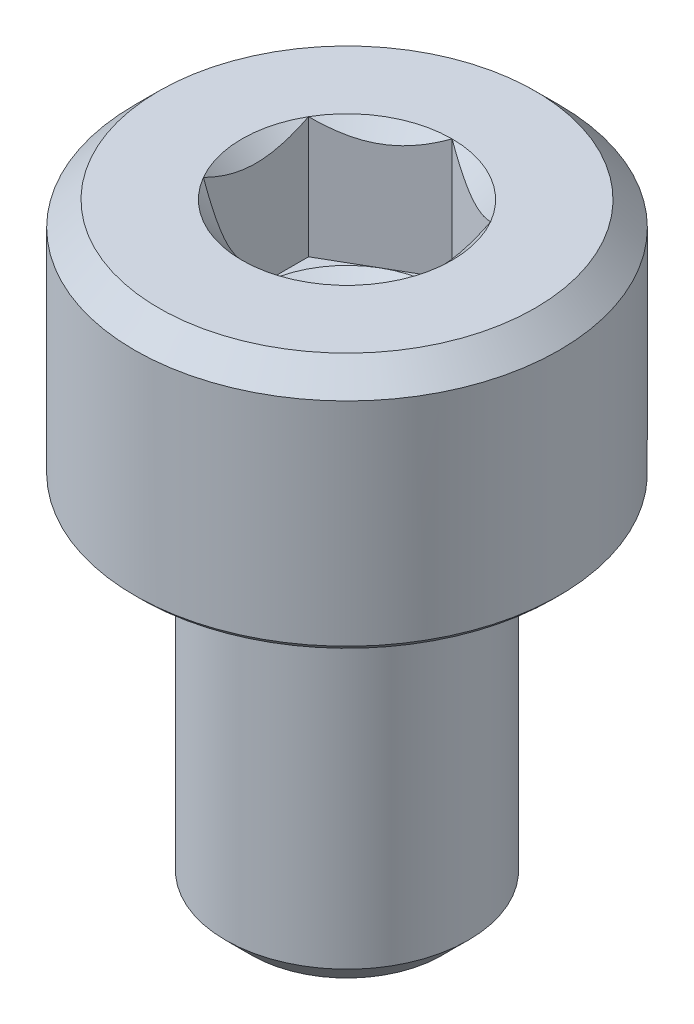
ISO-10303-21;
HEADER;
FILE_DESCRIPTION(('STEP AP214'),'2;1');
FILE_NAME('part.step','',(''),(''),'','','');
FILE_SCHEMA(('AUTOMOTIVE_DESIGN { 1 0 10303 214 1 1 1 1 }'));
ENDSEC;
DATA;
#1=APPLICATION_CONTEXT('core data for automotive mechanical design processes');
#2=APPLICATION_PROTOCOL_DEFINITION('international standard','automotive_design',2000,#1);
#3=PRODUCT_CONTEXT('',#1,'mechanical');
#4=PRODUCT('Part','Part','',(#3));
#5=PRODUCT_RELATED_PRODUCT_CATEGORY('part','',(#4));
#6=PRODUCT_DEFINITION_FORMATION('','',#4);
#7=PRODUCT_DEFINITION_CONTEXT('part definition',#1,'design');
#8=PRODUCT_DEFINITION('design','',#6,#7);
#9=PRODUCT_DEFINITION_SHAPE('','',#8);
#10=(LENGTH_UNIT() NAMED_UNIT(*) SI_UNIT(.MILLI.,.METRE.));
#11=(NAMED_UNIT(*) PLANE_ANGLE_UNIT() SI_UNIT($,.RADIAN.));
#12=(NAMED_UNIT(*) SI_UNIT($,.STERADIAN.) SOLID_ANGLE_UNIT());
#13=UNCERTAINTY_MEASURE_WITH_UNIT(LENGTH_MEASURE(1.E-05),#10,'distance_accuracy_value','');
#14=(GEOMETRIC_REPRESENTATION_CONTEXT(3) GLOBAL_UNCERTAINTY_ASSIGNED_CONTEXT((#13)) GLOBAL_UNIT_ASSIGNED_CONTEXT((#10,
#11,#12)) REPRESENTATION_CONTEXT('',''));
#15=CARTESIAN_POINT('',(0.,0.,0.));
#16=DIRECTION('',(0.,0.,1.));
#17=DIRECTION('',(1.,0.,0.));
#18=AXIS2_PLACEMENT_3D('',#15,#16,#17);
#19=CARTESIAN_POINT('',(1.5705,-6.,0.));
#20=DIRECTION('',(0.,1.,0.));
#21=DIRECTION('',(-1.,0.,0.));
#22=AXIS2_PLACEMENT_3D('',#19,#20,#21);
#23=PLANE('',#22);
#24=CARTESIAN_POINT('',(0.,-5.99999999997181,0.));
#25=DIRECTION('',(0.,1.,0.));
#26=DIRECTION('',(0.,0.,1.));
#27=AXIS2_PLACEMENT_3D('',#24,#25,#26);
#28=CIRCLE('',#27,1.57049999995706);
#29=CARTESIAN_POINT('',(0.,-5.99999999997181,1.57049999995706));
#30=VERTEX_POINT('',#29);
#31=EDGE_CURVE('E19',#30,#30,#28,.T.);
#32=ORIENTED_EDGE('',*,*,#31,.F.);
#33=EDGE_LOOP('',(#32));
#34=FACE_BOUND('',#33,.T.);
#35=ADVANCED_FACE('F16',(#34),#23,.F.);
#36=CARTESIAN_POINT('',(0.,2.00000000000261,0.));
#37=DIRECTION('',(0.,1.,0.));
#38=DIRECTION('',(0.,0.,1.));
#39=AXIS2_PLACEMENT_3D('',#36,#37,#38);
#40=CONICAL_SURFACE('',#39,1.4999999999985,1.04719755119661);
#41=CARTESIAN_POINT('',(0.,1.13397459621906,0.));
#42=VERTEX_POINT('',#41);
#43=VERTEX_LOOP('',#42);
#44=FACE_BOUND('',#43,.T.);
#45=CARTESIAN_POINT('',(0.,2.00000000000261,0.));
#46=DIRECTION('',(0.,1.,0.));
#47=DIRECTION('',(0.,0.,1.));
#48=AXIS2_PLACEMENT_3D('',#45,#46,#47);
#49=CIRCLE('',#48,1.4999999999985);
#50=CARTESIAN_POINT('',(0.749999999999625,2.00000000000131,-1.29903810567601));
#51=VERTEX_POINT('',#50);
#52=CARTESIAN_POINT('',(1.49999999999925,2.00000000000131,0.));
#53=VERTEX_POINT('',#52);
#54=EDGE_CURVE('E87',#51,#53,#49,.F.);
#55=ORIENTED_EDGE('',*,*,#54,.F.);
#56=CARTESIAN_POINT('',(0.,2.00000000000261,0.));
#57=DIRECTION('',(0.,1.,0.));
#58=DIRECTION('',(0.,0.,1.));
#59=AXIS2_PLACEMENT_3D('',#56,#57,#58);
#60=CIRCLE('',#59,1.4999999999985);
#61=CARTESIAN_POINT('',(-0.749999999999625,2.00000000000131,-1.29903810567601));
#62=VERTEX_POINT('',#61);
#63=EDGE_CURVE('E80',#62,#51,#60,.F.);
#64=ORIENTED_EDGE('',*,*,#63,.F.);
#65=CARTESIAN_POINT('',(0.,2.00000000000261,0.));
#66=DIRECTION('',(0.,1.,0.));
#67=DIRECTION('',(0.,0.,1.));
#68=AXIS2_PLACEMENT_3D('',#65,#66,#67);
#69=CIRCLE('',#68,1.4999999999985);
#70=CARTESIAN_POINT('',(-1.49999999999925,2.00000000000131,0.));
#71=VERTEX_POINT('',#70);
#72=EDGE_CURVE('E76',#71,#62,#69,.F.);
#73=ORIENTED_EDGE('',*,*,#72,.F.);
#74=CARTESIAN_POINT('',(0.,2.00000000000261,0.));
#75=DIRECTION('',(0.,1.,0.));
#76=DIRECTION('',(0.,0.,1.));
#77=AXIS2_PLACEMENT_3D('',#74,#75,#76);
#78=CIRCLE('',#77,1.4999999999985);
#79=CARTESIAN_POINT('',(-0.749999999999625,2.00000000000131,1.29903810567601));
#80=VERTEX_POINT('',#79);
#81=EDGE_CURVE('E373',#80,#71,#78,.F.);
#82=ORIENTED_EDGE('',*,*,#81,.F.);
#83=CARTESIAN_POINT('',(0.,2.00000000000261,0.));
#84=DIRECTION('',(0.,1.,0.));
#85=DIRECTION('',(0.,0.,1.));
#86=AXIS2_PLACEMENT_3D('',#83,#84,#85);
#87=CIRCLE('',#86,1.4999999999985);
#88=CARTESIAN_POINT('',(0.749999999999625,2.00000000000131,1.29903810567601));
#89=VERTEX_POINT('',#88);
#90=EDGE_CURVE('E375',#89,#80,#87,.F.);
#91=ORIENTED_EDGE('',*,*,#90,.F.);
#92=CARTESIAN_POINT('',(0.,2.00000000000261,0.));
#93=DIRECTION('',(0.,1.,0.));
#94=DIRECTION('',(0.,0.,1.));
#95=AXIS2_PLACEMENT_3D('',#92,#93,#94);
#96=CIRCLE('',#95,1.4999999999985);
#97=EDGE_CURVE('E89',#53,#89,#96,.F.);
#98=ORIENTED_EDGE('',*,*,#97,.F.);
#99=EDGE_LOOP('',(#55,#64,#73,#82,#91,#98));
#100=FACE_BOUND('',#99,.T.);
#101=ADVANCED_FACE('F83',(#44,#100),#40,.F.);
#102=CARTESIAN_POINT('',(0.,-5.57049999997616,0.));
#103=DIRECTION('',(0.,1.,0.));
#104=DIRECTION('',(0.,0.,1.));
#105=AXIS2_PLACEMENT_3D('',#102,#103,#104);
#106=CONICAL_SURFACE('',#105,1.99999999995271,0.785398163397448);
#107=CARTESIAN_POINT('',(0.,-5.5705,0.));
#108=DIRECTION('',(0.,1.,0.));
#109=DIRECTION('',(-1.,0.,0.));
#110=AXIS2_PLACEMENT_3D('',#107,#108,#109);
#111=CIRCLE('',#110,2.);
#112=CARTESIAN_POINT('',(-2.,-5.5705,0.));
#113=VERTEX_POINT('',#112);
#114=EDGE_CURVE('E94',#113,#113,#111,.T.);
#115=ORIENTED_EDGE('',*,*,#114,.F.);
#116=EDGE_LOOP('',(#115));
#117=FACE_BOUND('',#116,.T.);
#118=ORIENTED_EDGE('',*,*,#31,.T.);
#119=EDGE_LOOP('',(#118));
#120=FACE_BOUND('',#119,.T.);
#121=ADVANCED_FACE('F85',(#117,#120),#106,.T.);
#122=CARTESIAN_POINT('',(0.,2.,0.));
#123=DIRECTION('',(0.,1.,0.));
#124=DIRECTION('',(0.,0.,1.));
#125=AXIS2_PLACEMENT_3D('',#122,#123,#124);
#126=PLANE('',#125);
#127=DIRECTION('',(-0.866025403784439,0.,0.5));
#128=VECTOR('',#127,1.);
#129=CARTESIAN_POINT('',(0.,2.,-1.73205080756888));
#130=LINE('',#129,#128);
#131=CARTESIAN_POINT('',(-1.5,2.,-0.86602540378444));
#132=VERTEX_POINT('',#131);
#133=EDGE_CURVE('E138',#62,#132,#130,.T.);
#134=ORIENTED_EDGE('',*,*,#133,.T.);
#135=DIRECTION('',(0.,0.,1.));
#136=VECTOR('',#135,1.);
#137=CARTESIAN_POINT('',(-1.5,2.,-0.866025403784439));
#138=LINE('',#137,#136);
#139=EDGE_CURVE('E158',#132,#71,#138,.T.);
#140=ORIENTED_EDGE('',*,*,#139,.T.);
#141=ORIENTED_EDGE('',*,*,#72,.T.);
#142=EDGE_LOOP('',(#134,#140,#141));
#143=FACE_BOUND('',#142,.T.);
#144=ADVANCED_FACE('F368',(#143),#126,.T.);
#145=CARTESIAN_POINT('',(0.,2.,0.));
#146=DIRECTION('',(0.,1.,0.));
#147=DIRECTION('',(0.,0.,1.));
#148=AXIS2_PLACEMENT_3D('',#145,#146,#147);
#149=PLANE('',#148);
#150=DIRECTION('',(0.,0.,1.));
#151=VECTOR('',#150,1.);
#152=CARTESIAN_POINT('',(-1.5,2.,-0.866025403784439));
#153=LINE('',#152,#151);
#154=CARTESIAN_POINT('',(-1.5,2.,0.866025403784439));
#155=VERTEX_POINT('',#154);
#156=EDGE_CURVE('E137',#71,#155,#153,.T.);
#157=ORIENTED_EDGE('',*,*,#156,.T.);
#158=DIRECTION('',(0.866025403784439,0.,0.5));
#159=VECTOR('',#158,1.);
#160=CARTESIAN_POINT('',(-1.5,2.,0.866025403784439));
#161=LINE('',#160,#159);
#162=EDGE_CURVE('E147',#155,#80,#161,.T.);
#163=ORIENTED_EDGE('',*,*,#162,.T.);
#164=ORIENTED_EDGE('',*,*,#81,.T.);
#165=EDGE_LOOP('',(#157,#163,#164));
#166=FACE_BOUND('',#165,.T.);
#167=ADVANCED_FACE('F397',(#166),#149,.T.);
#168=CARTESIAN_POINT('',(0.,2.,0.));
#169=DIRECTION('',(0.,1.,0.));
#170=DIRECTION('',(0.,0.,1.));
#171=AXIS2_PLACEMENT_3D('',#168,#169,#170);
#172=PLANE('',#171);
#173=DIRECTION('',(0.866025403784439,0.,0.5));
#174=VECTOR('',#173,1.);
#175=CARTESIAN_POINT('',(-1.5,2.,0.866025403784439));
#176=LINE('',#175,#174);
#177=CARTESIAN_POINT('',(0.,2.,1.73205080756888));
#178=VERTEX_POINT('',#177);
#179=EDGE_CURVE('E154',#80,#178,#176,.T.);
#180=ORIENTED_EDGE('',*,*,#179,.T.);
#181=DIRECTION('',(0.866025403784439,0.,-0.5));
#182=VECTOR('',#181,1.);
#183=CARTESIAN_POINT('',(0.,2.,1.73205080756888));
#184=LINE('',#183,#182);
#185=EDGE_CURVE('E133',#178,#89,#184,.T.);
#186=ORIENTED_EDGE('',*,*,#185,.T.);
#187=ORIENTED_EDGE('',*,*,#90,.T.);
#188=EDGE_LOOP('',(#180,#186,#187));
#189=FACE_BOUND('',#188,.T.);
#190=ADVANCED_FACE('F386',(#189),#172,.T.);
#191=CARTESIAN_POINT('',(0.,2.,0.));
#192=DIRECTION('',(0.,1.,0.));
#193=DIRECTION('',(0.,0.,1.));
#194=AXIS2_PLACEMENT_3D('',#191,#192,#193);
#195=PLANE('',#194);
#196=DIRECTION('',(0.866025403784439,0.,-0.5));
#197=VECTOR('',#196,1.);
#198=CARTESIAN_POINT('',(0.,2.,1.73205080756888));
#199=LINE('',#198,#197);
#200=CARTESIAN_POINT('',(1.5,2.,0.86602540378444));
#201=VERTEX_POINT('',#200);
#202=EDGE_CURVE('E143',#89,#201,#199,.T.);
#203=ORIENTED_EDGE('',*,*,#202,.T.);
#204=DIRECTION('',(0.,0.,-1.));
#205=VECTOR('',#204,1.);
#206=CARTESIAN_POINT('',(1.5,2.,0.866025403784439));
#207=LINE('',#206,#205);
#208=EDGE_CURVE('E119',#201,#53,#207,.T.);
#209=ORIENTED_EDGE('',*,*,#208,.T.);
#210=ORIENTED_EDGE('',*,*,#97,.T.);
#211=EDGE_LOOP('',(#203,#209,#210));
#212=FACE_BOUND('',#211,.T.);
#213=ADVANCED_FACE('F381',(#212),#195,.T.);
#214=CARTESIAN_POINT('',(0.,2.,0.));
#215=DIRECTION('',(0.,1.,0.));
#216=DIRECTION('',(0.,0.,1.));
#217=AXIS2_PLACEMENT_3D('',#214,#215,#216);
#218=PLANE('',#217);
#219=DIRECTION('',(-0.866025403784439,0.,-0.5));
#220=VECTOR('',#219,1.);
#221=CARTESIAN_POINT('',(1.5,2.,-0.866025403784439));
#222=LINE('',#221,#220);
#223=CARTESIAN_POINT('',(0.,2.,-1.73205080756888));
#224=VERTEX_POINT('',#223);
#225=EDGE_CURVE('E101',#51,#224,#222,.T.);
#226=ORIENTED_EDGE('',*,*,#225,.T.);
#227=DIRECTION('',(-0.866025403784439,0.,0.5));
#228=VECTOR('',#227,1.);
#229=CARTESIAN_POINT('',(0.,2.,-1.73205080756888));
#230=LINE('',#229,#228);
#231=EDGE_CURVE('E103',#224,#62,#230,.T.);
#232=ORIENTED_EDGE('',*,*,#231,.T.);
#233=ORIENTED_EDGE('',*,*,#63,.T.);
#234=EDGE_LOOP('',(#226,#232,#233));
#235=FACE_BOUND('',#234,.T.);
#236=ADVANCED_FACE('F99',(#235),#218,.T.);
#237=CARTESIAN_POINT('',(0.,2.,0.));
#238=DIRECTION('',(0.,1.,0.));
#239=DIRECTION('',(0.,0.,1.));
#240=AXIS2_PLACEMENT_3D('',#237,#238,#239);
#241=PLANE('',#240);
#242=DIRECTION('',(0.,0.,-1.));
#243=VECTOR('',#242,1.);
#244=CARTESIAN_POINT('',(1.5,2.,0.866025403784439));
#245=LINE('',#244,#243);
#246=CARTESIAN_POINT('',(1.5,2.,-0.866025403784438));
#247=VERTEX_POINT('',#246);
#248=EDGE_CURVE('E110',#53,#247,#245,.T.);
#249=ORIENTED_EDGE('',*,*,#248,.T.);
#250=DIRECTION('',(-0.866025403784439,0.,-0.5));
#251=VECTOR('',#250,1.);
#252=CARTESIAN_POINT('',(1.5,2.,-0.866025403784439));
#253=LINE('',#252,#251);
#254=EDGE_CURVE('E107',#247,#51,#253,.T.);
#255=ORIENTED_EDGE('',*,*,#254,.T.);
#256=ORIENTED_EDGE('',*,*,#54,.T.);
#257=EDGE_LOOP('',(#249,#255,#256));
#258=FACE_BOUND('',#257,.T.);
#259=ADVANCED_FACE('F108',(#258),#241,.T.);
#260=CARTESIAN_POINT('',(0.,-6.,0.));
#261=DIRECTION('',(0.,1.,0.));
#262=DIRECTION('',(-1.,0.,0.));
#263=AXIS2_PLACEMENT_3D('',#260,#261,#262);
#264=CYLINDRICAL_SURFACE('',#263,2.);
#265=CARTESIAN_POINT('',(0.,-0.600000000019918,0.));
#266=DIRECTION('',(0.,1.,0.));
#267=DIRECTION('',(-1.,0.,0.));
#268=AXIS2_PLACEMENT_3D('',#265,#266,#267);
#269=CIRCLE('',#268,2.00000000000244);
#270=CARTESIAN_POINT('',(-2.00000000000244,-0.600000000019918,0.));
#271=VERTEX_POINT('',#270);
#272=EDGE_CURVE('E112',#271,#271,#269,.T.);
#273=ORIENTED_EDGE('',*,*,#272,.F.);
#274=EDGE_LOOP('',(#273));
#275=FACE_BOUND('',#274,.T.);
#276=ORIENTED_EDGE('',*,*,#114,.T.);
#277=EDGE_LOOP('',(#276));
#278=FACE_BOUND('',#277,.T.);
#279=ADVANCED_FACE('F364',(#275,#278),#264,.T.);
#280=CARTESIAN_POINT('',(0.,2.,-1.73205080756888));
#281=DIRECTION('',(-0.5,0.,-0.866025403784439));
#282=DIRECTION('',(-0.866025403784439,0.,0.5));
#283=AXIS2_PLACEMENT_3D('',#280,#281,#282);
#284=PLANE('',#283);
#285=DIRECTION('',(0.,1.,0.));
#286=VECTOR('',#285,1.);
#287=CARTESIAN_POINT('',(0.,2.,-1.73205080756888));
#288=LINE('',#287,#286);
#289=CARTESIAN_POINT('',(0.,3.99999999999445,-1.73205080759353));
#290=VERTEX_POINT('',#289);
#291=EDGE_CURVE('E118',#224,#290,#288,.T.);
#292=ORIENTED_EDGE('',*,*,#291,.T.);
#293=CARTESIAN_POINT('',(1.98900492664778E-11,3.99999999998036,-1.73205080758447));
#294=CARTESIAN_POINT('',(-0.0515557327218723,3.9702628495306,-1.70228509140512));
#295=CARTESIAN_POINT('',(-0.103973478108473,3.94227250028152,-1.67202169199477));
#296=CARTESIAN_POINT('',(-0.210858640181372,3.8910233657158,-1.61031151489881));
#297=CARTESIAN_POINT('',(-0.265336216097922,3.86779308608304,-1.57885887177888));
#298=CARTESIAN_POINT('',(-0.375187576287768,3.82799946093732,-1.51543615940264));
#299=CARTESIAN_POINT('',(-0.430533399802326,3.81133612264063,-1.48348223329791));
#300=CARTESIAN_POINT('',(-0.54244314456462,3.7856630755944,-1.4188711120344));
#301=CARTESIAN_POINT('',(-0.5990036495935,3.77663421007201,-1.3862158892305));
#302=CARTESIAN_POINT('',(-0.696490927020539,3.76848741062904,-1.32993158336544));
#303=CARTESIAN_POINT('',(-0.737291861709177,3.76728188242068,-1.30637515273977));
#304=CARTESIAN_POINT('',(-0.818821659077838,3.76931613813336,-1.25930390228199));
#305=CARTESIAN_POINT('',(-0.859550503847645,3.77255690401126,-1.23578909279036));
#306=CARTESIAN_POINT('',(-0.940615934585783,3.78329730522417,-1.18898594453173));
#307=CARTESIAN_POINT('',(-0.980952120271275,3.79080090082896,-1.16569783686813));
#308=CARTESIAN_POINT('',(-1.06094744849378,3.80965947351707,-1.11951251258495));
#309=CARTESIAN_POINT('',(-1.10060629283147,3.82101610321421,-1.09661546813084));
#310=CARTESIAN_POINT('',(-1.20214987011615,3.85471858131515,-1.03798925645105));
#311=CARTESIAN_POINT('',(-1.26340587963875,3.87960098344693,-1.00262308286369));
#312=CARTESIAN_POINT('',(-1.35347611099817,3.92160373016034,-0.950621010542359));
#313=CARTESIAN_POINT('',(-1.38315704846333,3.9363606542418,-0.933484713307047));
#314=CARTESIAN_POINT('',(-1.44197336893312,3.96722152790591,-0.899527094851072));
#315=CARTESIAN_POINT('',(-1.47110900353878,3.983324836533,-0.882705628368482));
#316=CARTESIAN_POINT('',(-1.50000000002124,3.99999999998206,-0.866025403772176));
#317=B_SPLINE_CURVE_WITH_KNOTS('',3,(#293,#294,#295,#296,#297,#298,#299,#300,#301,#302,#303,
#304,#305,#306,#307,#308,#309,#310,#311,#312,#313,#314,#315,#316),.UNSPECIFIED.,.F.,.F.,(4,2,2,
2,2,2,2,2,2,2,2,4),(0.,0.199774419877176,0.400712312211926,0.598459990240766,0.795709985578917,
0.93689469069767,1.07811058124969,1.2194578797526,1.36086588065799,1.58533909973934,
1.69726364726216,1.80913521245555),.UNSPECIFIED.);
#318=CARTESIAN_POINT('',(-1.5000000000105,4.00000000000051,-0.866025403827682));
#319=VERTEX_POINT('',#318);
#320=EDGE_CURVE('E275',#290,#319,#317,.T.);
#321=ORIENTED_EDGE('',*,*,#320,.T.);
#322=DIRECTION('',(0.,1.,0.));
#323=VECTOR('',#322,1.);
#324=CARTESIAN_POINT('',(-1.5,2.,-0.866025403784439));
#325=LINE('',#324,#323);
#326=EDGE_CURVE('E167',#319,#132,#325,.F.);
#327=ORIENTED_EDGE('',*,*,#326,.T.);
#328=ORIENTED_EDGE('',*,*,#133,.F.);
#329=ORIENTED_EDGE('',*,*,#231,.F.);
#330=EDGE_LOOP('',(#292,#321,#327,#328,#329));
#331=FACE_BOUND('',#330,.T.);
#332=ADVANCED_FACE('F266',(#331),#284,.F.);
#333=CARTESIAN_POINT('',(-1.5,2.,-0.866025403784439));
#334=DIRECTION('',(-1.,0.,0.));
#335=DIRECTION('',(0.,0.,1.));
#336=AXIS2_PLACEMENT_3D('',#333,#334,#335);
#337=PLANE('',#336);
#338=ORIENTED_EDGE('',*,*,#326,.F.);
#339=CARTESIAN_POINT('',(-1.50000000000356,3.99999999998036,-0.866025403809461));
#340=CARTESIAN_POINT('',(-1.50000000000128,3.9702628495306,-0.806493971454697));
#341=CARTESIAN_POINT('',(-1.50000000000034,3.94227250028152,-0.745967172635623));
#342=CARTESIAN_POINT('',(-1.49999999999965,3.8910233657158,-0.622546818444895));
#343=CARTESIAN_POINT('',(-1.49999999999991,3.86779308608304,-0.559641532204604));
#344=CARTESIAN_POINT('',(-1.50000000000009,3.82799946093732,-0.432796107451801));
#345=CARTESIAN_POINT('',(-1.50000000000002,3.81133612264063,-0.36888825524246));
#346=CARTESIAN_POINT('',(-1.49999999999998,3.7856630755944,-0.239666012715526));
#347=CARTESIAN_POINT('',(-1.49999999999999,3.77663421007201,-0.174355567107687));
#348=CARTESIAN_POINT('',(-1.5,3.76848741062903,-0.0617869553775629));
#349=CARTESIAN_POINT('',(-1.5,3.76728188242067,-0.0146740941262143));
#350=CARTESIAN_POINT('',(-1.5,3.76931613813336,0.0794684067893298));
#351=CARTESIAN_POINT('',(-1.5,3.77255690401126,0.126498025772591));
#352=CARTESIAN_POINT('',(-1.5,3.78329730522417,0.220104322289865));
#353=CARTESIAN_POINT('',(-1.5,3.79080090082896,0.266680537617068));
#354=CARTESIAN_POINT('',(-1.5,3.80965947351707,0.359051186183419));
#355=CARTESIAN_POINT('',(-1.5,3.8210161032142,0.404845275091643));
#356=CARTESIAN_POINT('',(-1.5,3.85471858131514,0.522097698451225));
#357=CARTESIAN_POINT('',(-1.5,3.87960098344693,0.592830045625938));
#358=CARTESIAN_POINT('',(-1.5,3.92160373016033,0.696834190268603));
#359=CARTESIAN_POINT('',(-1.5,3.9363606542418,0.731106784739228));
#360=CARTESIAN_POINT('',(-1.5,3.96722152790591,0.799022021651177));
#361=CARTESIAN_POINT('',(-1.5,3.983324836533,0.832664954616357));
#362=CARTESIAN_POINT('',(-1.5,3.99999999998206,0.86602540380897));
#363=B_SPLINE_CURVE_WITH_KNOTS('',3,(#339,#340,#341,#342,#343,#344,#345,#346,#347,#348,#349,
#350,#351,#352,#353,#354,#355,#356,#357,#358,#359,#360,#361,#362),.UNSPECIFIED.,.F.,.F.,(4,2,2,
2,2,2,2,2,2,2,2,4),(0.,0.199774419877176,0.400712312211926,0.598459990240766,0.795709985578917,
0.93689469069767,1.07811058124969,1.2194578797526,1.36086588065799,1.58533909973934,
1.69726364726217,1.80913521245555),.UNSPECIFIED.);
#364=CARTESIAN_POINT('',(-1.5000000000427,4.00000000000051,0.866025403771909));
#365=VERTEX_POINT('',#364);
#366=EDGE_CURVE('E270',#319,#365,#363,.T.);
#367=ORIENTED_EDGE('',*,*,#366,.T.);
#368=DIRECTION('',(0.,1.,0.));
#369=VECTOR('',#368,1.);
#370=CARTESIAN_POINT('',(-1.5,2.,0.866025403784439));
#371=LINE('',#370,#369);
#372=EDGE_CURVE('E157',#365,#155,#371,.F.);
#373=ORIENTED_EDGE('',*,*,#372,.T.);
#374=ORIENTED_EDGE('',*,*,#156,.F.);
#375=ORIENTED_EDGE('',*,*,#139,.F.);
#376=EDGE_LOOP('',(#338,#367,#373,#374,#375));
#377=FACE_BOUND('',#376,.T.);
#378=ADVANCED_FACE('F261',(#377),#337,.F.);
#379=CARTESIAN_POINT('',(-1.5,2.,0.866025403784439));
#380=DIRECTION('',(-0.5,0.,0.866025403784439));
#381=DIRECTION('',(0.866025403784439,0.,0.5));
#382=AXIS2_PLACEMENT_3D('',#379,#380,#381);
#383=PLANE('',#382);
#384=ORIENTED_EDGE('',*,*,#372,.F.);
#385=CARTESIAN_POINT('',(-1.50000000002345,3.99999999998036,0.866025403775008));
#386=CARTESIAN_POINT('',(-1.44844426727941,3.9702628495306,0.895791119950418));
#387=CARTESIAN_POINT('',(-1.39602652189187,3.94227250028152,0.926054519359145));
#388=CARTESIAN_POINT('',(-1.28914135981828,3.8910233657158,0.987764696453912));
#389=CARTESIAN_POINT('',(-1.23466378390199,3.86779308608304,1.01921733957428));
#390=CARTESIAN_POINT('',(-1.12481242371232,3.82799946093732,1.08264005195084));
#391=CARTESIAN_POINT('',(-1.0694666001977,3.81133612264063,1.11459397805545));
#392=CARTESIAN_POINT('',(-0.957556855435357,3.7856630755944,1.17920509931887));
#393=CARTESIAN_POINT('',(-0.900996350406496,3.77663421007201,1.21186032212281));
#394=CARTESIAN_POINT('',(-0.803509072979466,3.76848741062903,1.26814462798788));
#395=CARTESIAN_POINT('',(-0.762708138290825,3.76728188242067,1.29170105861355));
#396=CARTESIAN_POINT('',(-0.681178340922163,3.76931613813336,1.33877230907132));
#397=CARTESIAN_POINT('',(-0.640449496152357,3.77255690401126,1.36228711856295));
#398=CARTESIAN_POINT('',(-0.559384065414219,3.78329730522417,1.40909026682159));
#399=CARTESIAN_POINT('',(-0.519047879728727,3.79080090082896,1.43237837448519));
#400=CARTESIAN_POINT('',(-0.439052551506222,3.80965947351707,1.47856369876837));
#401=CARTESIAN_POINT('',(-0.399393707168537,3.8210161032142,1.50146074322248));
#402=CARTESIAN_POINT('',(-0.297850129883851,3.85471858131514,1.56008695490227));
#403=CARTESIAN_POINT('',(-0.236594120361249,3.87960098344693,1.59545312848963));
#404=CARTESIAN_POINT('',(-0.14652388900183,3.92160373016033,1.64745520081096));
#405=CARTESIAN_POINT('',(-0.116842951536667,3.9363606542418,1.66459149804627));
#406=CARTESIAN_POINT('',(-0.0580266310668799,3.96722152790591,1.69854911650225));
#407=CARTESIAN_POINT('',(-0.0288909964612174,3.983324836533,1.71537058298484));
#408=CARTESIAN_POINT('',(2.12453028237684E-11,3.99999999998206,1.73205080758114));
#409=B_SPLINE_CURVE_WITH_KNOTS('',3,(#385,#386,#387,#388,#389,#390,#391,#392,#393,#394,#395,
#396,#397,#398,#399,#400,#401,#402,#403,#404,#405,#406,#407,#408),.UNSPECIFIED.,.F.,.F.,(4,2,2,
2,2,2,2,2,2,2,2,4),(0.,0.199774419877176,0.400712312211926,0.598459990240765,0.795709985578917,
0.93689469069767,1.07811058124969,1.2194578797526,1.36086588065799,1.58533909973934,
1.69726364726217,1.80913521245555),.UNSPECIFIED.);
#410=CARTESIAN_POINT('',(-3.21967947812064E-11,4.00000000000051,1.73205080759959));
#411=VERTEX_POINT('',#410);
#412=EDGE_CURVE('E245',#365,#411,#409,.T.);
#413=ORIENTED_EDGE('',*,*,#412,.T.);
#414=DIRECTION('',(0.,1.,0.));
#415=VECTOR('',#414,1.);
#416=CARTESIAN_POINT('',(0.,2.,1.73205080756888));
#417=LINE('',#416,#415);
#418=EDGE_CURVE('E146',#411,#178,#417,.F.);
#419=ORIENTED_EDGE('',*,*,#418,.T.);
#420=ORIENTED_EDGE('',*,*,#179,.F.);
#421=ORIENTED_EDGE('',*,*,#162,.F.);
#422=EDGE_LOOP('',(#384,#413,#419,#420,#421));
#423=FACE_BOUND('',#422,.T.);
#424=ADVANCED_FACE('F255',(#423),#383,.F.);
#425=CARTESIAN_POINT('',(0.,2.,1.73205080756888));
#426=DIRECTION('',(0.5,0.,0.866025403784439));
#427=DIRECTION('',(0.866025403784439,0.,-0.5));
#428=AXIS2_PLACEMENT_3D('',#425,#426,#427);
#429=PLANE('',#428);
#430=ORIENTED_EDGE('',*,*,#418,.F.);
#431=CARTESIAN_POINT('',(-1.98894923821861E-11,3.99999999998036,1.73205080758447));
#432=CARTESIAN_POINT('',(0.0515557327218724,3.9702628495306,1.70228509140512));
#433=CARTESIAN_POINT('',(0.103973478108473,3.94227250028152,1.67202169199477));
#434=CARTESIAN_POINT('',(0.210858640181371,3.8910233657158,1.61031151489881));
#435=CARTESIAN_POINT('',(0.265336216097922,3.86779308608304,1.57885887177888));
#436=CARTESIAN_POINT('',(0.375187576287768,3.82799946093732,1.51543615940264));
#437=CARTESIAN_POINT('',(0.430533399802326,3.81133612264063,1.48348223329791));
#438=CARTESIAN_POINT('',(0.54244314456462,3.7856630755944,1.4188711120344));
#439=CARTESIAN_POINT('',(0.5990036495935,3.77663421007202,1.3862158892305));
#440=CARTESIAN_POINT('',(0.696490927020539,3.76848741062904,1.32993158336544));
#441=CARTESIAN_POINT('',(0.737291861709177,3.76728188242068,1.30637515273977));
#442=CARTESIAN_POINT('',(0.818821659077838,3.76931613813336,1.25930390228199));
#443=CARTESIAN_POINT('',(0.859550503847645,3.77255690401126,1.23578909279036));
#444=CARTESIAN_POINT('',(0.940615934585784,3.78329730522417,1.18898594453173));
#445=CARTESIAN_POINT('',(0.980952120271276,3.79080090082896,1.16569783686813));
#446=CARTESIAN_POINT('',(1.06094744849378,3.80965947351708,1.11951251258495));
#447=CARTESIAN_POINT('',(1.10060629283147,3.82101610321421,1.09661546813084));
#448=CARTESIAN_POINT('',(1.20214987011615,3.85471858131515,1.03798925645105));
#449=CARTESIAN_POINT('',(1.26340587963875,3.87960098344693,1.00262308286369));
#450=CARTESIAN_POINT('',(1.35347611099817,3.92160373016034,0.950621010542359));
#451=CARTESIAN_POINT('',(1.38315704846333,3.9363606542418,0.933484713307047));
#452=CARTESIAN_POINT('',(1.44197336893312,3.96722152790591,0.899527094851072));
#453=CARTESIAN_POINT('',(1.47110900353878,3.983324836533,0.882705628368483));
#454=CARTESIAN_POINT('',(1.50000000002124,3.99999999998206,0.866025403772176));
#455=B_SPLINE_CURVE_WITH_KNOTS('',3,(#431,#432,#433,#434,#435,#436,#437,#438,#439,#440,#441,
#442,#443,#444,#445,#446,#447,#448,#449,#450,#451,#452,#453,#454),.UNSPECIFIED.,.F.,.F.,(4,2,2,
2,2,2,2,2,2,2,2,4),(0.,0.199774419877176,0.400712312211926,0.598459990240765,0.795709985578917,
0.93689469069767,1.07811058124969,1.2194578797526,1.36086588065799,1.58533909973934,
1.69726364726216,1.80913521245555),.UNSPECIFIED.);
#456=CARTESIAN_POINT('',(1.5000000000105,4.00000000000051,0.866025403827681));
#457=VERTEX_POINT('',#456);
#458=EDGE_CURVE('E239',#411,#457,#455,.T.);
#459=ORIENTED_EDGE('',*,*,#458,.T.);
#460=DIRECTION('',(0.,1.,0.));
#461=VECTOR('',#460,1.);
#462=CARTESIAN_POINT('',(1.5,2.,0.866025403784439));
#463=LINE('',#462,#461);
#464=EDGE_CURVE('E122',#457,#201,#463,.F.);
#465=ORIENTED_EDGE('',*,*,#464,.T.);
#466=ORIENTED_EDGE('',*,*,#202,.F.);
#467=ORIENTED_EDGE('',*,*,#185,.F.);
#468=EDGE_LOOP('',(#430,#459,#465,#466,#467));
#469=FACE_BOUND('',#468,.T.);
#470=ADVANCED_FACE('F251',(#469),#429,.F.);
#471=CARTESIAN_POINT('',(1.5,2.,0.866025403784439));
#472=DIRECTION('',(1.,0.,0.));
#473=DIRECTION('',(0.,0.,-1.));
#474=AXIS2_PLACEMENT_3D('',#471,#472,#473);
#475=PLANE('',#474);
#476=ORIENTED_EDGE('',*,*,#464,.F.);
#477=CARTESIAN_POINT('',(1.50000000000356,3.99999999998036,0.86602540380946));
#478=CARTESIAN_POINT('',(1.50000000000128,3.9702628495306,0.806493971454697));
#479=CARTESIAN_POINT('',(1.50000000000034,3.94227250028152,0.745967172635622));
#480=CARTESIAN_POINT('',(1.49999999999965,3.8910233657158,0.622546818444894));
#481=CARTESIAN_POINT('',(1.49999999999991,3.86779308608304,0.559641532204604));
#482=CARTESIAN_POINT('',(1.50000000000009,3.82799946093732,0.4327961074518));
#483=CARTESIAN_POINT('',(1.50000000000002,3.81133612264063,0.368888255242459));
#484=CARTESIAN_POINT('',(1.49999999999998,3.7856630755944,0.239666012715525));
#485=CARTESIAN_POINT('',(1.49999999999999,3.77663421007201,0.174355567107686));
#486=CARTESIAN_POINT('',(1.5,3.76848741062903,0.0617869553775617));
#487=CARTESIAN_POINT('',(1.5,3.76728188242067,0.0146740941262131));
#488=CARTESIAN_POINT('',(1.5,3.76931613813336,-0.0794684067893313));
#489=CARTESIAN_POINT('',(1.5,3.77255690401126,-0.126498025772592));
#490=CARTESIAN_POINT('',(1.5,3.78329730522417,-0.220104322289866));
#491=CARTESIAN_POINT('',(1.5,3.79080090082896,-0.266680537617069));
#492=CARTESIAN_POINT('',(1.5,3.80965947351707,-0.35905118618342));
#493=CARTESIAN_POINT('',(1.5,3.82101610321421,-0.404845275091644));
#494=CARTESIAN_POINT('',(1.5,3.85471858131514,-0.522097698451227));
#495=CARTESIAN_POINT('',(1.5,3.87960098344693,-0.592830045625939));
#496=CARTESIAN_POINT('',(1.5,3.92160373016033,-0.696834190268603));
#497=CARTESIAN_POINT('',(1.5,3.9363606542418,-0.731106784739228));
#498=CARTESIAN_POINT('',(1.5,3.96722152790591,-0.799022021651177));
#499=CARTESIAN_POINT('',(1.5,3.983324836533,-0.832664954616356));
#500=CARTESIAN_POINT('',(1.5,3.99999999998206,-0.866025403808969));
#501=B_SPLINE_CURVE_WITH_KNOTS('',3,(#477,#478,#479,#480,#481,#482,#483,#484,#485,#486,#487,
#488,#489,#490,#491,#492,#493,#494,#495,#496,#497,#498,#499,#500),.UNSPECIFIED.,.F.,.F.,(4,2,2,
2,2,2,2,2,2,2,2,4),(0.,0.199774419877176,0.400712312211926,0.598459990240766,0.795709985578918,
0.93689469069767,1.07811058124969,1.2194578797526,1.36086588065799,1.58533909973934,
1.69726364726217,1.80913521245555),.UNSPECIFIED.);
#502=CARTESIAN_POINT('',(1.5000000000427,4.00000000000051,-0.866025403771909));
#503=VERTEX_POINT('',#502);
#504=EDGE_CURVE('E34',#457,#503,#501,.T.);
#505=ORIENTED_EDGE('',*,*,#504,.T.);
#506=DIRECTION('',(0.,1.,0.));
#507=VECTOR('',#506,1.);
#508=CARTESIAN_POINT('',(1.5,2.,-0.866025403784439));
#509=LINE('',#508,#507);
#510=EDGE_CURVE('E113',#503,#247,#509,.F.);
#511=ORIENTED_EDGE('',*,*,#510,.T.);
#512=ORIENTED_EDGE('',*,*,#248,.F.);
#513=ORIENTED_EDGE('',*,*,#208,.F.);
#514=EDGE_LOOP('',(#476,#505,#511,#512,#513));
#515=FACE_BOUND('',#514,.T.);
#516=ADVANCED_FACE('F254',(#515),#475,.F.);
#517=CARTESIAN_POINT('',(1.5,2.,-0.866025403784439));
#518=DIRECTION('',(0.5,0.,-0.866025403784439));
#519=DIRECTION('',(-0.866025403784439,0.,-0.5));
#520=AXIS2_PLACEMENT_3D('',#517,#518,#519);
#521=PLANE('',#520);
#522=ORIENTED_EDGE('',*,*,#510,.F.);
#523=CARTESIAN_POINT('',(1.50000000002345,3.99999999998036,-0.866025403775007));
#524=CARTESIAN_POINT('',(1.44844426727941,3.9702628495306,-0.895791119950418));
#525=CARTESIAN_POINT('',(1.39602652189187,3.94227250028152,-0.926054519359145));
#526=CARTESIAN_POINT('',(1.28914135981828,3.8910233657158,-0.987764696453912));
#527=CARTESIAN_POINT('',(1.23466378390199,3.86779308608304,-1.01921733957428));
#528=CARTESIAN_POINT('',(1.12481242371232,3.82799946093732,-1.08264005195084));
#529=CARTESIAN_POINT('',(1.0694666001977,3.81133612264063,-1.11459397805545));
#530=CARTESIAN_POINT('',(0.957556855435357,3.7856630755944,-1.17920509931888));
#531=CARTESIAN_POINT('',(0.900996350406495,3.77663421007201,-1.21186032212281));
#532=CARTESIAN_POINT('',(0.803509072979466,3.76848741062903,-1.26814462798788));
#533=CARTESIAN_POINT('',(0.762708138290825,3.76728188242067,-1.29170105861355));
#534=CARTESIAN_POINT('',(0.681178340922162,3.76931613813336,-1.33877230907132));
#535=CARTESIAN_POINT('',(0.640449496152356,3.77255690401126,-1.36228711856295));
#536=CARTESIAN_POINT('',(0.559384065414218,3.78329730522417,-1.40909026682159));
#537=CARTESIAN_POINT('',(0.519047879728726,3.79080090082896,-1.43237837448519));
#538=CARTESIAN_POINT('',(0.439052551506221,3.80965947351707,-1.47856369876837));
#539=CARTESIAN_POINT('',(0.399393707168536,3.82101610321421,-1.50146074322248));
#540=CARTESIAN_POINT('',(0.29785012988385,3.85471858131514,-1.56008695490227));
#541=CARTESIAN_POINT('',(0.236594120361248,3.87960098344693,-1.59545312848963));
#542=CARTESIAN_POINT('',(0.14652388900183,3.92160373016033,-1.64745520081096));
#543=CARTESIAN_POINT('',(0.116842951536667,3.9363606542418,-1.66459149804627));
#544=CARTESIAN_POINT('',(0.0580266310668803,3.96722152790591,-1.69854911650225));
#545=CARTESIAN_POINT('',(0.0288909964612181,3.983324836533,-1.71537058298484));
#546=CARTESIAN_POINT('',(-2.12445683320751E-11,3.99999999998206,-1.73205080758114));
#547=B_SPLINE_CURVE_WITH_KNOTS('',3,(#523,#524,#525,#526,#527,#528,#529,#530,#531,#532,#533,
#534,#535,#536,#537,#538,#539,#540,#541,#542,#543,#544,#545,#546),.UNSPECIFIED.,.F.,.F.,(4,2,2,
2,2,2,2,2,2,2,2,4),(0.,0.199774419877176,0.400712312211926,0.598459990240766,0.795709985578918,
0.936894690697671,1.07811058124969,1.2194578797526,1.36086588065799,1.58533909973934,
1.69726364726217,1.80913521245555),.UNSPECIFIED.);
#548=EDGE_CURVE('E204',#503,#290,#547,.T.);
#549=ORIENTED_EDGE('',*,*,#548,.T.);
#550=ORIENTED_EDGE('',*,*,#291,.F.);
#551=ORIENTED_EDGE('',*,*,#225,.F.);
#552=ORIENTED_EDGE('',*,*,#254,.F.);
#553=EDGE_LOOP('',(#522,#549,#550,#551,#552));
#554=FACE_BOUND('',#553,.T.);
#555=ADVANCED_FACE('F116',(#554),#521,.F.);
#556=CARTESIAN_POINT('',(0.,0.,0.));
#557=DIRECTION('',(0.,1.,0.));
#558=DIRECTION('',(-1.,0.,0.));
#559=AXIS2_PLACEMENT_3D('',#556,#557,#558);
#560=CONICAL_SURFACE('',#559,2.049999999997,0.0831412318806008);
#561=CARTESIAN_POINT('',(0.,0.,0.));
#562=DIRECTION('',(0.,1.,0.));
#563=DIRECTION('',(-1.,0.,0.));
#564=AXIS2_PLACEMENT_3D('',#561,#562,#563);
#565=CIRCLE('',#564,2.049999999997);
#566=CARTESIAN_POINT('',(-2.049999999997,0.,0.));
#567=VERTEX_POINT('',#566);
#568=EDGE_CURVE('E201',#567,#567,#565,.F.);
#569=ORIENTED_EDGE('',*,*,#568,.T.);
#570=EDGE_LOOP('',(#569));
#571=FACE_BOUND('',#570,.T.);
#572=ORIENTED_EDGE('',*,*,#272,.T.);
#573=EDGE_LOOP('',(#572));
#574=FACE_BOUND('',#573,.T.);
#575=ADVANCED_FACE('F287',(#571,#574),#560,.T.);
#576=CARTESIAN_POINT('',(0.,3.99999999990541,0.));
#577=DIRECTION('',(0.,1.,0.));
#578=DIRECTION('',(0.,0.,1.));
#579=AXIS2_PLACEMENT_3D('',#576,#577,#578);
#580=CONICAL_SURFACE('',#579,1.73205080750449,0.785398163397448);
#581=ORIENTED_EDGE('',*,*,#320,.F.);
#582=CARTESIAN_POINT('',(0.,4.0000000000191,0.));
#583=DIRECTION('',(0.,1.,0.));
#584=DIRECTION('',(0.,0.,1.));
#585=AXIS2_PLACEMENT_3D('',#582,#583,#584);
#586=CIRCLE('',#585,1.73205080761818);
#587=EDGE_CURVE('E198',#290,#319,#586,.T.);
#588=ORIENTED_EDGE('',*,*,#587,.T.);
#589=EDGE_LOOP('',(#581,#588));
#590=FACE_BOUND('',#589,.T.);
#591=ADVANCED_FACE('F283',(#590),#580,.F.);
#592=CARTESIAN_POINT('',(0.,3.99999999990541,0.));
#593=DIRECTION('',(0.,1.,0.));
#594=DIRECTION('',(0.,0.,1.));
#595=AXIS2_PLACEMENT_3D('',#592,#593,#594);
#596=CONICAL_SURFACE('',#595,1.73205080750449,0.785398163397448);
#597=ORIENTED_EDGE('',*,*,#366,.F.);
#598=CARTESIAN_POINT('',(0.,4.0000000000191,0.));
#599=DIRECTION('',(0.,1.,0.));
#600=DIRECTION('',(0.,0.,1.));
#601=AXIS2_PLACEMENT_3D('',#598,#599,#600);
#602=CIRCLE('',#601,1.73205080761818);
#603=EDGE_CURVE('E195',#319,#365,#602,.T.);
#604=ORIENTED_EDGE('',*,*,#603,.T.);
#605=EDGE_LOOP('',(#597,#604));
#606=FACE_BOUND('',#605,.T.);
#607=ADVANCED_FACE('F280',(#606),#596,.F.);
#608=CARTESIAN_POINT('',(0.,3.99999999990541,0.));
#609=DIRECTION('',(0.,1.,0.));
#610=DIRECTION('',(0.,0.,1.));
#611=AXIS2_PLACEMENT_3D('',#608,#609,#610);
#612=CONICAL_SURFACE('',#611,1.73205080750449,0.785398163397448);
#613=ORIENTED_EDGE('',*,*,#412,.F.);
#614=CARTESIAN_POINT('',(0.,4.0000000000191,0.));
#615=DIRECTION('',(0.,1.,0.));
#616=DIRECTION('',(0.,0.,1.));
#617=AXIS2_PLACEMENT_3D('',#614,#615,#616);
#618=CIRCLE('',#617,1.73205080761818);
#619=EDGE_CURVE('E192',#365,#411,#618,.T.);
#620=ORIENTED_EDGE('',*,*,#619,.T.);
#621=EDGE_LOOP('',(#613,#620));
#622=FACE_BOUND('',#621,.T.);
#623=ADVANCED_FACE('F235',(#622),#612,.F.);
#624=CARTESIAN_POINT('',(0.,3.99999999990541,0.));
#625=DIRECTION('',(0.,1.,0.));
#626=DIRECTION('',(0.,0.,1.));
#627=AXIS2_PLACEMENT_3D('',#624,#625,#626);
#628=CONICAL_SURFACE('',#627,1.73205080750449,0.785398163397448);
#629=ORIENTED_EDGE('',*,*,#458,.F.);
#630=CARTESIAN_POINT('',(0.,4.0000000000191,0.));
#631=DIRECTION('',(0.,1.,0.));
#632=DIRECTION('',(0.,0.,1.));
#633=AXIS2_PLACEMENT_3D('',#630,#631,#632);
#634=CIRCLE('',#633,1.73205080761818);
#635=EDGE_CURVE('E189',#411,#457,#634,.T.);
#636=ORIENTED_EDGE('',*,*,#635,.T.);
#637=EDGE_LOOP('',(#629,#636));
#638=FACE_BOUND('',#637,.T.);
#639=ADVANCED_FACE('F230',(#638),#628,.F.);
#640=CARTESIAN_POINT('',(0.,3.99999999990541,0.));
#641=DIRECTION('',(0.,1.,0.));
#642=DIRECTION('',(0.,0.,1.));
#643=AXIS2_PLACEMENT_3D('',#640,#641,#642);
#644=CONICAL_SURFACE('',#643,1.73205080750449,0.785398163397448);
#645=ORIENTED_EDGE('',*,*,#504,.F.);
#646=CARTESIAN_POINT('',(0.,4.0000000000191,0.));
#647=DIRECTION('',(0.,1.,0.));
#648=DIRECTION('',(0.,0.,1.));
#649=AXIS2_PLACEMENT_3D('',#646,#647,#648);
#650=CIRCLE('',#649,1.73205080761818);
#651=EDGE_CURVE('E186',#457,#503,#650,.T.);
#652=ORIENTED_EDGE('',*,*,#651,.T.);
#653=EDGE_LOOP('',(#645,#652));
#654=FACE_BOUND('',#653,.T.);
#655=ADVANCED_FACE('F224',(#654),#644,.F.);
#656=CARTESIAN_POINT('',(0.,3.99999999990541,0.));
#657=DIRECTION('',(0.,1.,0.));
#658=DIRECTION('',(0.,0.,1.));
#659=AXIS2_PLACEMENT_3D('',#656,#657,#658);
#660=CONICAL_SURFACE('',#659,1.73205080750449,0.785398163397448);
#661=ORIENTED_EDGE('',*,*,#548,.F.);
#662=CARTESIAN_POINT('',(0.,4.0000000000191,0.));
#663=DIRECTION('',(0.,1.,0.));
#664=DIRECTION('',(0.,0.,1.));
#665=AXIS2_PLACEMENT_3D('',#662,#663,#664);
#666=CIRCLE('',#665,1.73205080761818);
#667=EDGE_CURVE('E183',#503,#290,#666,.T.);
#668=ORIENTED_EDGE('',*,*,#667,.T.);
#669=EDGE_LOOP('',(#661,#668));
#670=FACE_BOUND('',#669,.T.);
#671=ADVANCED_FACE('F219',(#670),#660,.F.);
#672=CARTESIAN_POINT('',(3.4,0.,0.));
#673=DIRECTION('',(0.,1.,0.));
#674=DIRECTION('',(-1.,0.,0.));
#675=AXIS2_PLACEMENT_3D('',#672,#673,#674);
#676=PLANE('',#675);
#677=CARTESIAN_POINT('',(0.,5.68435408335524E-11,0.));
#678=DIRECTION('',(0.,1.,0.));
#679=DIRECTION('',(-1.,0.,0.));
#680=AXIS2_PLACEMENT_3D('',#677,#678,#679);
#681=CIRCLE('',#680,3.39999999999918);
#682=CARTESIAN_POINT('',(-3.39999999999918,5.68434420937117E-11,0.));
#683=VERTEX_POINT('',#682);
#684=EDGE_CURVE('E180',#683,#683,#681,.T.);
#685=ORIENTED_EDGE('',*,*,#684,.F.);
#686=EDGE_LOOP('',(#685));
#687=FACE_BOUND('',#686,.T.);
#688=ORIENTED_EDGE('',*,*,#568,.F.);
#689=EDGE_LOOP('',(#688));
#690=FACE_BOUND('',#689,.T.);
#691=ADVANCED_FACE('F223',(#687,#690),#676,.F.);
#692=CARTESIAN_POINT('',(1.73205080756888,4.,0.));
#693=DIRECTION('',(0.,-1.,0.));
#694=DIRECTION('',(1.,0.,0.));
#695=AXIS2_PLACEMENT_3D('',#692,#693,#694);
#696=PLANE('',#695);
#697=ORIENTED_EDGE('',*,*,#651,.F.);
#698=ORIENTED_EDGE('',*,*,#635,.F.);
#699=ORIENTED_EDGE('',*,*,#619,.F.);
#700=ORIENTED_EDGE('',*,*,#603,.F.);
#701=ORIENTED_EDGE('',*,*,#587,.F.);
#702=ORIENTED_EDGE('',*,*,#667,.F.);
#703=EDGE_LOOP('',(#697,#698,#699,#700,#701,#702));
#704=FACE_BOUND('',#703,.T.);
#705=CARTESIAN_POINT('',(0.,4.0000000000191,0.));
#706=DIRECTION('',(0.,-1.,0.));
#707=DIRECTION('',(1.,0.,0.));
#708=AXIS2_PLACEMENT_3D('',#705,#706,#707);
#709=CIRCLE('',#708,3.0999999999608);
#710=CARTESIAN_POINT('',(3.0999999999608,4.0000000000191,0.));
#711=VERTEX_POINT('',#710);
#712=EDGE_CURVE('E177',#711,#711,#709,.T.);
#713=ORIENTED_EDGE('',*,*,#712,.F.);
#714=EDGE_LOOP('',(#713));
#715=FACE_BOUND('',#714,.T.);
#716=ADVANCED_FACE('F310',(#704,#715),#696,.F.);
#717=CARTESIAN_POINT('',(0.,0.100000000088585,0.));
#718=DIRECTION('',(0.,1.,0.));
#719=DIRECTION('',(-1.,0.,0.));
#720=AXIS2_PLACEMENT_3D('',#717,#718,#719);
#721=CONICAL_SURFACE('',#720,3.49999999997408,0.785398163113231);
#722=CARTESIAN_POINT('',(0.,0.1,0.));
#723=DIRECTION('',(0.,1.,0.));
#724=DIRECTION('',(-1.,0.,0.));
#725=AXIS2_PLACEMENT_3D('',#722,#723,#724);
#726=CIRCLE('',#725,3.5);
#727=CARTESIAN_POINT('',(-3.5,0.1,0.));
#728=VERTEX_POINT('',#727);
#729=EDGE_CURVE('E25',#728,#728,#726,.T.);
#730=ORIENTED_EDGE('',*,*,#729,.F.);
#731=EDGE_LOOP('',(#730));
#732=FACE_BOUND('',#731,.T.);
#733=ORIENTED_EDGE('',*,*,#684,.T.);
#734=EDGE_LOOP('',(#733));
#735=FACE_BOUND('',#734,.T.);
#736=ADVANCED_FACE('F304',(#732,#735),#721,.T.);
#737=CARTESIAN_POINT('',(0.,3.60000000000582,0.));
#738=DIRECTION('',(0.,-1.,0.));
#739=DIRECTION('',(1.,0.,0.));
#740=AXIS2_PLACEMENT_3D('',#737,#738,#739);
#741=CONICAL_SURFACE('',#740,3.49999999997408,0.785398163397448);
#742=ORIENTED_EDGE('',*,*,#712,.T.);
#743=EDGE_LOOP('',(#742));
#744=FACE_BOUND('',#743,.T.);
#745=CARTESIAN_POINT('',(0.,3.6,0.));
#746=DIRECTION('',(0.,1.,0.));
#747=DIRECTION('',(-1.,0.,0.));
#748=AXIS2_PLACEMENT_3D('',#745,#746,#747);
#749=CIRCLE('',#748,3.5);
#750=CARTESIAN_POINT('',(-3.5,3.6,0.));
#751=VERTEX_POINT('',#750);
#752=EDGE_CURVE('E10',#751,#751,#749,.F.);
#753=ORIENTED_EDGE('',*,*,#752,.F.);
#754=EDGE_LOOP('',(#753));
#755=FACE_BOUND('',#754,.T.);
#756=ADVANCED_FACE('F298',(#744,#755),#741,.T.);
#757=CARTESIAN_POINT('',(0.,-6.,0.));
#758=DIRECTION('',(0.,1.,0.));
#759=DIRECTION('',(-1.,0.,0.));
#760=AXIS2_PLACEMENT_3D('',#757,#758,#759);
#761=CYLINDRICAL_SURFACE('',#760,3.5);
#762=ORIENTED_EDGE('',*,*,#752,.T.);
#763=EDGE_LOOP('',(#762));
#764=FACE_BOUND('',#763,.T.);
#765=ORIENTED_EDGE('',*,*,#729,.T.);
#766=EDGE_LOOP('',(#765));
#767=FACE_BOUND('',#766,.T.);
#768=ADVANCED_FACE('F296',(#764,#767),#761,.T.);
#769=CLOSED_SHELL('',(#35,#101,#121,#144,#167,#190,#213,#236,#259,#279,#332,#378,#424,#470,#516,
#555,#575,#591,#607,#623,#639,#655,#671,#691,#716,#736,#756,#768));
#770=MANIFOLD_SOLID_BREP('B1',#769);
#771=ADVANCED_BREP_SHAPE_REPRESENTATION('',(#18,#770),#14);
#772=SHAPE_DEFINITION_REPRESENTATION(#9,#771);
ENDSEC;
END-ISO-10303-21;
